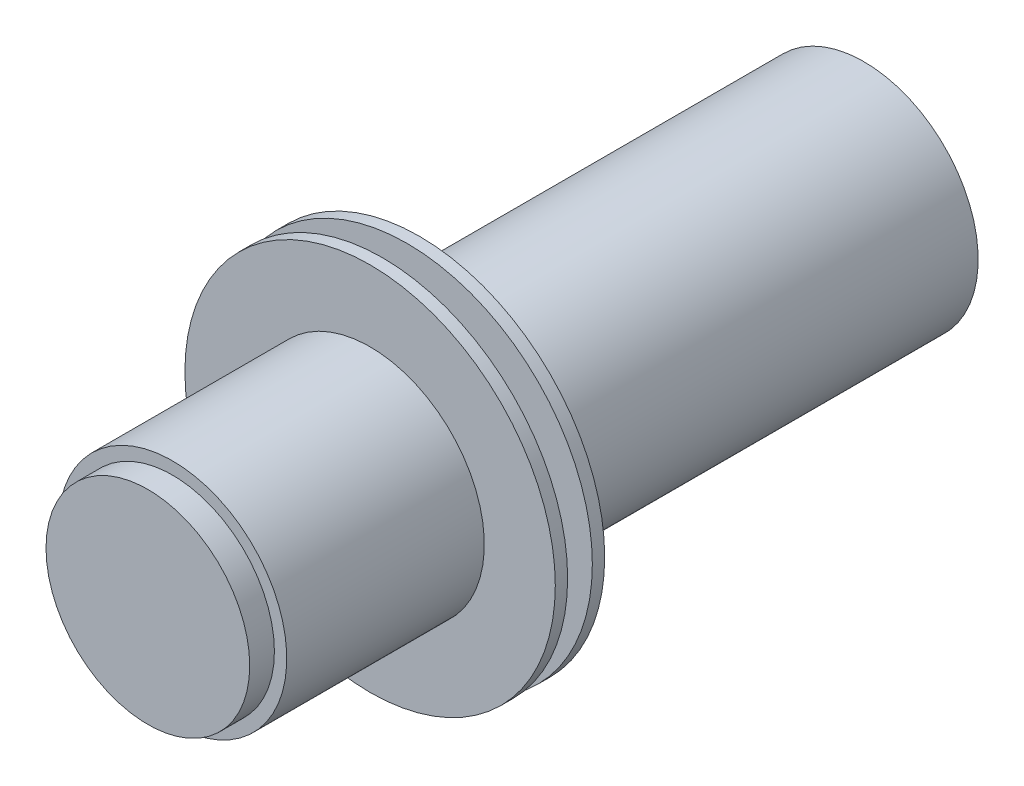
ISO-10303-21;
HEADER;
FILE_DESCRIPTION(('STEP AP214'),'2;1');
FILE_NAME('part.step','',(''),(''),'','','');
FILE_SCHEMA(('AUTOMOTIVE_DESIGN { 1 0 10303 214 1 1 1 1 }'));
ENDSEC;
DATA;
#1=APPLICATION_CONTEXT('core data for automotive mechanical design processes');
#2=APPLICATION_PROTOCOL_DEFINITION('international standard','automotive_design',2000,#1);
#3=PRODUCT_CONTEXT('',#1,'mechanical');
#4=PRODUCT('Part','Part','',(#3));
#5=PRODUCT_RELATED_PRODUCT_CATEGORY('part','',(#4));
#6=PRODUCT_DEFINITION_FORMATION('','',#4);
#7=PRODUCT_DEFINITION_CONTEXT('part definition',#1,'design');
#8=PRODUCT_DEFINITION('design','',#6,#7);
#9=PRODUCT_DEFINITION_SHAPE('','',#8);
#10=(LENGTH_UNIT() NAMED_UNIT(*) SI_UNIT(.MILLI.,.METRE.));
#11=(NAMED_UNIT(*) PLANE_ANGLE_UNIT() SI_UNIT($,.RADIAN.));
#12=(NAMED_UNIT(*) SI_UNIT($,.STERADIAN.) SOLID_ANGLE_UNIT());
#13=UNCERTAINTY_MEASURE_WITH_UNIT(LENGTH_MEASURE(1.E-05),#10,'distance_accuracy_value','');
#14=(GEOMETRIC_REPRESENTATION_CONTEXT(3) GLOBAL_UNCERTAINTY_ASSIGNED_CONTEXT((#13)) GLOBAL_UNIT_ASSIGNED_CONTEXT((#10,
#11,#12)) REPRESENTATION_CONTEXT('',''));
#15=CARTESIAN_POINT('',(0.,0.,0.));
#16=DIRECTION('',(0.,0.,1.));
#17=DIRECTION('',(1.,0.,0.));
#18=AXIS2_PLACEMENT_3D('',#15,#16,#17);
#19=CARTESIAN_POINT('',(0.,0.,58.));
#20=DIRECTION('',(0.,0.,-1.));
#21=DIRECTION('',(-1.,0.,0.));
#22=AXIS2_PLACEMENT_3D('',#19,#20,#21);
#23=CYLINDRICAL_SURFACE('',#22,9.25);
#24=CARTESIAN_POINT('',(0.,0.,37.));
#25=DIRECTION('',(0.,0.,1.));
#26=DIRECTION('',(1.,0.,0.));
#27=AXIS2_PLACEMENT_3D('',#24,#25,#26);
#28=CIRCLE('',#27,9.25);
#29=CARTESIAN_POINT('',(-9.25,0.,37.));
#30=VERTEX_POINT('',#29);
#31=EDGE_CURVE('E48',#30,#30,#28,.T.);
#32=CARTESIAN_POINT('',(0.,0.,39.));
#33=DIRECTION('',(0.,0.,1.));
#34=DIRECTION('',(1.,0.,0.));
#35=AXIS2_PLACEMENT_3D('',#32,#33,#34);
#36=CIRCLE('',#35,9.25);
#37=CARTESIAN_POINT('',(-9.25,0.,39.));
#38=VERTEX_POINT('',#37);
#39=EDGE_CURVE('E10',#38,#38,#36,.T.);
#40=CARTESIAN_POINT('',(-9.25,0.,37.));
#41=CARTESIAN_POINT('',(-9.25,0.,37.0208333333333));
#42=CARTESIAN_POINT('',(-9.25,0.,37.0416666666667));
#43=CARTESIAN_POINT('',(-9.25,0.,37.0833333333333));
#44=CARTESIAN_POINT('',(-9.25,0.,37.1041666666667));
#45=CARTESIAN_POINT('',(-9.25,0.,37.1458333333333));
#46=CARTESIAN_POINT('',(-9.25,0.,37.1666666666667));
#47=CARTESIAN_POINT('',(-9.25,0.,37.2083333333333));
#48=CARTESIAN_POINT('',(-9.25,0.,37.2291666666667));
#49=CARTESIAN_POINT('',(-9.25,0.,37.2708333333333));
#50=CARTESIAN_POINT('',(-9.25,0.,37.2916666666667));
#51=CARTESIAN_POINT('',(-9.25,0.,37.3333333333333));
#52=CARTESIAN_POINT('',(-9.25,0.,37.3541666666667));
#53=CARTESIAN_POINT('',(-9.25,0.,37.3958333333333));
#54=CARTESIAN_POINT('',(-9.25,0.,37.4166666666667));
#55=CARTESIAN_POINT('',(-9.25,0.,37.4583333333333));
#56=CARTESIAN_POINT('',(-9.25,0.,37.4791666666667));
#57=CARTESIAN_POINT('',(-9.25,0.,37.5208333333333));
#58=CARTESIAN_POINT('',(-9.25,0.,37.5416666666667));
#59=CARTESIAN_POINT('',(-9.25,0.,37.5833333333333));
#60=CARTESIAN_POINT('',(-9.25,0.,37.6041666666667));
#61=CARTESIAN_POINT('',(-9.25,0.,37.6458333333333));
#62=CARTESIAN_POINT('',(-9.25,0.,37.6666666666667));
#63=CARTESIAN_POINT('',(-9.25,0.,37.7083333333333));
#64=CARTESIAN_POINT('',(-9.25,0.,37.7291666666667));
#65=CARTESIAN_POINT('',(-9.25,0.,37.7708333333333));
#66=CARTESIAN_POINT('',(-9.25,0.,37.7916666666667));
#67=CARTESIAN_POINT('',(-9.25,0.,37.8333333333333));
#68=CARTESIAN_POINT('',(-9.25,0.,37.8541666666667));
#69=CARTESIAN_POINT('',(-9.25,0.,37.8958333333333));
#70=CARTESIAN_POINT('',(-9.25,0.,37.9166666666667));
#71=CARTESIAN_POINT('',(-9.25,0.,37.9583333333333));
#72=CARTESIAN_POINT('',(-9.25,0.,37.9791666666667));
#73=CARTESIAN_POINT('',(-9.25,0.,38.0208333333333));
#74=CARTESIAN_POINT('',(-9.25,0.,38.0416666666667));
#75=CARTESIAN_POINT('',(-9.25,0.,38.0833333333333));
#76=CARTESIAN_POINT('',(-9.25,0.,38.1041666666667));
#77=CARTESIAN_POINT('',(-9.25,0.,38.1458333333333));
#78=CARTESIAN_POINT('',(-9.25,0.,38.1666666666667));
#79=CARTESIAN_POINT('',(-9.25,0.,38.2083333333333));
#80=CARTESIAN_POINT('',(-9.25,0.,38.2291666666667));
#81=CARTESIAN_POINT('',(-9.25,0.,38.2708333333333));
#82=CARTESIAN_POINT('',(-9.25,0.,38.2916666666667));
#83=CARTESIAN_POINT('',(-9.25,0.,38.3333333333333));
#84=CARTESIAN_POINT('',(-9.25,0.,38.3541666666667));
#85=CARTESIAN_POINT('',(-9.25,0.,38.3958333333333));
#86=CARTESIAN_POINT('',(-9.25,0.,38.4166666666667));
#87=CARTESIAN_POINT('',(-9.25,0.,38.4583333333333));
#88=CARTESIAN_POINT('',(-9.25,0.,38.4791666666667));
#89=CARTESIAN_POINT('',(-9.25,0.,38.5208333333333));
#90=CARTESIAN_POINT('',(-9.25,0.,38.5416666666667));
#91=CARTESIAN_POINT('',(-9.25,0.,38.5833333333333));
#92=CARTESIAN_POINT('',(-9.25,0.,38.6041666666667));
#93=CARTESIAN_POINT('',(-9.25,0.,38.6458333333333));
#94=CARTESIAN_POINT('',(-9.25,0.,38.6666666666667));
#95=CARTESIAN_POINT('',(-9.25,0.,38.7083333333333));
#96=CARTESIAN_POINT('',(-9.25,0.,38.7291666666667));
#97=CARTESIAN_POINT('',(-9.25,0.,38.7708333333333));
#98=CARTESIAN_POINT('',(-9.25,0.,38.7916666666667));
#99=CARTESIAN_POINT('',(-9.25,0.,38.8333333333333));
#100=CARTESIAN_POINT('',(-9.25,0.,38.8541666666667));
#101=CARTESIAN_POINT('',(-9.25,0.,38.8958333333333));
#102=CARTESIAN_POINT('',(-9.25,0.,38.9166666666667));
#103=CARTESIAN_POINT('',(-9.25,0.,38.9583333333333));
#104=CARTESIAN_POINT('',(-9.25,0.,38.9791666666667));
#105=CARTESIAN_POINT('',(-9.25,0.,39.));
#106=B_SPLINE_CURVE_WITH_KNOTS('',3,(#40,#41,#42,#43,#44,#45,#46,#47,#48,#49,#50,#51,#52,#53,
#54,#55,#56,#57,#58,#59,#60,#61,#62,#63,#64,#65,#66,#67,#68,#69,#70,#71,#72,#73,#74,#75,#76,#77,
#78,#79,#80,#81,#82,#83,#84,#85,#86,#87,#88,#89,#90,#91,#92,#93,#94,#95,#96,#97,#98,#99,#100,
#101,#102,#103,#104,#105),.UNSPECIFIED.,.F.,.F.,(4,2,2,2,2,2,2,2,2,2,2,2,2,2,2,2,2,2,2,2,2,2,2,
2,2,2,2,2,2,2,2,2,4),(0.,0.0624999999999931,0.125,0.187499999999993,0.25,0.312499999999993,
0.375,0.437499999999993,0.5,0.562499999999994,0.625000000000001,0.687499999999994,
0.750000000000001,0.812499999999994,0.875000000000001,0.937499999999994,1.,1.06249999999999,
1.125,1.18749999999999,1.25,1.31249999999999,1.375,1.43749999999999,1.5,1.56249999999999,1.625,
1.68749999999999,1.75,1.81249999999999,1.875,1.93749999999999,2.),.UNSPECIFIED.);
#107=EDGE_CURVE('BSEAM33',#30,#38,#106,.T.);
#108=ORIENTED_EDGE('',*,*,#31,.T.);
#109=ORIENTED_EDGE('',*,*,#39,.F.);
#110=ORIENTED_EDGE('',*,*,#107,.T.);
#111=ORIENTED_EDGE('',*,*,#107,.F.);
#112=EDGE_LOOP('',(#108,#110,#109,#111));
#113=FACE_BOUND('',#112,.T.);
#114=ADVANCED_FACE('F33',(#113),#23,.T.);
#115=CARTESIAN_POINT('',(0.,0.,37.));
#116=DIRECTION('',(0.,0.,-1.));
#117=DIRECTION('',(-1.,0.,0.));
#118=AXIS2_PLACEMENT_3D('',#115,#116,#117);
#119=CYLINDRICAL_SURFACE('',#118,15.);
#120=CARTESIAN_POINT('',(0.,0.,37.));
#121=DIRECTION('',(0.,0.,1.));
#122=DIRECTION('',(1.,0.,0.));
#123=AXIS2_PLACEMENT_3D('',#120,#121,#122);
#124=CIRCLE('',#123,15.);
#125=CARTESIAN_POINT('',(15.,0.,37.));
#126=VERTEX_POINT('',#125);
#127=EDGE_CURVE('E51',#126,#126,#124,.T.);
#128=ORIENTED_EDGE('',*,*,#127,.F.);
#129=EDGE_LOOP('',(#128));
#130=FACE_BOUND('',#129,.T.);
#131=CARTESIAN_POINT('',(0.,0.,36.));
#132=DIRECTION('',(0.,0.,1.));
#133=DIRECTION('',(1.,0.,0.));
#134=AXIS2_PLACEMENT_3D('',#131,#132,#133);
#135=CIRCLE('',#134,15.);
#136=CARTESIAN_POINT('',(15.,0.,36.));
#137=VERTEX_POINT('',#136);
#138=EDGE_CURVE('E63',#137,#137,#135,.T.);
#139=ORIENTED_EDGE('',*,*,#138,.T.);
#140=EDGE_LOOP('',(#139));
#141=FACE_BOUND('',#140,.T.);
#142=ADVANCED_FACE('F95',(#130,#141),#119,.T.);
#143=CARTESIAN_POINT('',(0.,0.,37.));
#144=DIRECTION('',(0.,0.,1.));
#145=DIRECTION('',(1.,0.,0.));
#146=AXIS2_PLACEMENT_3D('',#143,#144,#145);
#147=PLANE('',#146);
#148=ORIENTED_EDGE('',*,*,#31,.F.);
#149=EDGE_LOOP('',(#148));
#150=FACE_BOUND('',#149,.T.);
#151=ORIENTED_EDGE('',*,*,#127,.T.);
#152=EDGE_LOOP('',(#151));
#153=FACE_BOUND('',#152,.T.);
#154=ADVANCED_FACE('F102',(#150,#153),#147,.T.);
#155=CARTESIAN_POINT('',(0.,0.,36.));
#156=DIRECTION('',(0.,0.,1.));
#157=DIRECTION('',(1.,0.,0.));
#158=AXIS2_PLACEMENT_3D('',#155,#156,#157);
#159=PLANE('',#158);
#160=CARTESIAN_POINT('',(0.,0.,36.));
#161=DIRECTION('',(0.,0.,1.));
#162=DIRECTION('',(1.,0.,0.));
#163=AXIS2_PLACEMENT_3D('',#160,#161,#162);
#164=CIRCLE('',#163,9.25);
#165=CARTESIAN_POINT('',(-9.25,0.,36.));
#166=VERTEX_POINT('',#165);
#167=EDGE_CURVE('E41',#166,#166,#164,.T.);
#168=ORIENTED_EDGE('',*,*,#167,.T.);
#169=EDGE_LOOP('',(#168));
#170=FACE_BOUND('',#169,.T.);
#171=ORIENTED_EDGE('',*,*,#138,.F.);
#172=EDGE_LOOP('',(#171));
#173=FACE_BOUND('',#172,.T.);
#174=ADVANCED_FACE('F128',(#170,#173),#159,.F.);
#175=CARTESIAN_POINT('',(0.,0.,0.));
#176=DIRECTION('',(0.,0.,1.));
#177=DIRECTION('',(1.,0.,0.));
#178=AXIS2_PLACEMENT_3D('',#175,#176,#177);
#179=PLANE('',#178);
#180=CARTESIAN_POINT('',(0.,0.,0.));
#181=DIRECTION('',(0.,0.,1.));
#182=DIRECTION('',(1.,0.,0.));
#183=AXIS2_PLACEMENT_3D('',#180,#181,#182);
#184=CIRCLE('',#183,9.25);
#185=CARTESIAN_POINT('',(-9.25,0.,0.));
#186=VERTEX_POINT('',#185);
#187=EDGE_CURVE('E45',#186,#186,#184,.T.);
#188=ORIENTED_EDGE('',*,*,#187,.F.);
#189=EDGE_LOOP('',(#188));
#190=FACE_BOUND('',#189,.T.);
#191=ADVANCED_FACE('F106',(#190),#179,.F.);
#192=CARTESIAN_POINT('',(-9.25,0.,0.));
#193=CARTESIAN_POINT('',(-9.25,0.,0.375));
#194=CARTESIAN_POINT('',(-9.25,0.,0.750000000000001));
#195=CARTESIAN_POINT('',(-9.25,0.,1.5));
#196=CARTESIAN_POINT('',(-9.25,0.,1.875));
#197=CARTESIAN_POINT('',(-9.25,0.,2.625));
#198=CARTESIAN_POINT('',(-9.25,0.,3.));
#199=CARTESIAN_POINT('',(-9.25,0.,3.75));
#200=CARTESIAN_POINT('',(-9.25,0.,4.125));
#201=CARTESIAN_POINT('',(-9.25,0.,4.875));
#202=CARTESIAN_POINT('',(-9.25,0.,5.25));
#203=CARTESIAN_POINT('',(-9.25,0.,6.));
#204=CARTESIAN_POINT('',(-9.25,0.,6.375));
#205=CARTESIAN_POINT('',(-9.25,0.,7.125));
#206=CARTESIAN_POINT('',(-9.25,0.,7.5));
#207=CARTESIAN_POINT('',(-9.25,0.,8.25));
#208=CARTESIAN_POINT('',(-9.25,0.,8.625));
#209=CARTESIAN_POINT('',(-9.25,0.,9.375));
#210=CARTESIAN_POINT('',(-9.25,0.,9.75));
#211=CARTESIAN_POINT('',(-9.25,0.,10.5));
#212=CARTESIAN_POINT('',(-9.25,0.,10.875));
#213=CARTESIAN_POINT('',(-9.25,0.,11.625));
#214=CARTESIAN_POINT('',(-9.25,0.,12.));
#215=CARTESIAN_POINT('',(-9.25,0.,12.75));
#216=CARTESIAN_POINT('',(-9.25,0.,13.125));
#217=CARTESIAN_POINT('',(-9.25,0.,13.875));
#218=CARTESIAN_POINT('',(-9.25,0.,14.25));
#219=CARTESIAN_POINT('',(-9.25,0.,15.));
#220=CARTESIAN_POINT('',(-9.25,0.,15.375));
#221=CARTESIAN_POINT('',(-9.25,0.,16.125));
#222=CARTESIAN_POINT('',(-9.25,0.,16.5));
#223=CARTESIAN_POINT('',(-9.25,0.,17.25));
#224=CARTESIAN_POINT('',(-9.25,0.,17.625));
#225=CARTESIAN_POINT('',(-9.25,0.,18.375));
#226=CARTESIAN_POINT('',(-9.25,0.,18.75));
#227=CARTESIAN_POINT('',(-9.25,0.,19.5));
#228=CARTESIAN_POINT('',(-9.25,0.,19.875));
#229=CARTESIAN_POINT('',(-9.25,0.,20.625));
#230=CARTESIAN_POINT('',(-9.25,0.,21.));
#231=CARTESIAN_POINT('',(-9.25,0.,21.75));
#232=CARTESIAN_POINT('',(-9.25,0.,22.125));
#233=CARTESIAN_POINT('',(-9.25,0.,22.875));
#234=CARTESIAN_POINT('',(-9.25,0.,23.25));
#235=CARTESIAN_POINT('',(-9.25,0.,24.));
#236=CARTESIAN_POINT('',(-9.25,0.,24.375));
#237=CARTESIAN_POINT('',(-9.25,0.,25.125));
#238=CARTESIAN_POINT('',(-9.25,0.,25.5));
#239=CARTESIAN_POINT('',(-9.25,0.,26.25));
#240=CARTESIAN_POINT('',(-9.25,0.,26.625));
#241=CARTESIAN_POINT('',(-9.25,0.,27.375));
#242=CARTESIAN_POINT('',(-9.25,0.,27.75));
#243=CARTESIAN_POINT('',(-9.25,0.,28.5));
#244=CARTESIAN_POINT('',(-9.25,0.,28.875));
#245=CARTESIAN_POINT('',(-9.25,0.,29.625));
#246=CARTESIAN_POINT('',(-9.25,0.,30.));
#247=CARTESIAN_POINT('',(-9.25,0.,30.75));
#248=CARTESIAN_POINT('',(-9.25,0.,31.125));
#249=CARTESIAN_POINT('',(-9.25,0.,31.875));
#250=CARTESIAN_POINT('',(-9.25,0.,32.25));
#251=CARTESIAN_POINT('',(-9.25,0.,33.));
#252=CARTESIAN_POINT('',(-9.25,0.,33.375));
#253=CARTESIAN_POINT('',(-9.25,0.,34.125));
#254=CARTESIAN_POINT('',(-9.25,0.,34.5));
#255=CARTESIAN_POINT('',(-9.25,0.,35.25));
#256=CARTESIAN_POINT('',(-9.25,0.,35.625));
#257=CARTESIAN_POINT('',(-9.25,0.,36.));
#258=B_SPLINE_CURVE_WITH_KNOTS('',3,(#192,#193,#194,#195,#196,#197,#198,#199,#200,#201,#202,
#203,#204,#205,#206,#207,#208,#209,#210,#211,#212,#213,#214,#215,#216,#217,#218,#219,#220,#221,
#222,#223,#224,#225,#226,#227,#228,#229,#230,#231,#232,#233,#234,#235,#236,#237,#238,#239,#240,
#241,#242,#243,#244,#245,#246,#247,#248,#249,#250,#251,#252,#253,#254,#255,#256,#257),
.UNSPECIFIED.,.F.,.F.,(4,2,2,2,2,2,2,2,2,2,2,2,2,2,2,2,2,2,2,2,2,2,2,2,2,2,2,2,2,2,2,2,4),(0.,
1.125,2.25,3.375,4.5,5.625,6.75,7.875,9.,10.125,11.25,12.375,13.5,14.625,15.75,16.875,18.,
19.125,20.25,21.375,22.5,23.625,24.75,25.875,27.,28.125,29.25,30.375,31.5,32.625,33.75,34.875,
36.),.UNSPECIFIED.);
#259=EDGE_CURVE('BSEAM91',#186,#166,#258,.T.);
#260=ORIENTED_EDGE('',*,*,#187,.T.);
#261=ORIENTED_EDGE('',*,*,#167,.F.);
#262=ORIENTED_EDGE('',*,*,#259,.T.);
#263=ORIENTED_EDGE('',*,*,#259,.F.);
#264=EDGE_LOOP('',(#260,#262,#261,#263));
#265=FACE_BOUND('',#264,.T.);
#266=ADVANCED_FACE('F91',(#265),#23,.T.);
#267=CARTESIAN_POINT('',(0.,0.,40.));
#268=DIRECTION('',(0.,0.,-1.));
#269=DIRECTION('',(-1.,0.,0.));
#270=AXIS2_PLACEMENT_3D('',#267,#268,#269);
#271=CYLINDRICAL_SURFACE('',#270,15.);
#272=CARTESIAN_POINT('',(0.,0.,40.));
#273=DIRECTION('',(0.,0.,1.));
#274=DIRECTION('',(1.,0.,0.));
#275=AXIS2_PLACEMENT_3D('',#272,#273,#274);
#276=CIRCLE('',#275,15.);
#277=CARTESIAN_POINT('',(15.,0.,40.));
#278=VERTEX_POINT('',#277);
#279=EDGE_CURVE('E71',#278,#278,#276,.T.);
#280=ORIENTED_EDGE('',*,*,#279,.F.);
#281=EDGE_LOOP('',(#280));
#282=FACE_BOUND('',#281,.T.);
#283=CARTESIAN_POINT('',(0.,0.,39.));
#284=DIRECTION('',(0.,0.,1.));
#285=DIRECTION('',(1.,0.,0.));
#286=AXIS2_PLACEMENT_3D('',#283,#284,#285);
#287=CIRCLE('',#286,15.);
#288=CARTESIAN_POINT('',(15.,0.,39.));
#289=VERTEX_POINT('',#288);
#290=EDGE_CURVE('E68',#289,#289,#287,.T.);
#291=ORIENTED_EDGE('',*,*,#290,.T.);
#292=EDGE_LOOP('',(#291));
#293=FACE_BOUND('',#292,.T.);
#294=ADVANCED_FACE('F83',(#282,#293),#271,.T.);
#295=CARTESIAN_POINT('',(0.,0.,40.));
#296=DIRECTION('',(0.,0.,1.));
#297=DIRECTION('',(1.,0.,0.));
#298=AXIS2_PLACEMENT_3D('',#295,#296,#297);
#299=PLANE('',#298);
#300=CARTESIAN_POINT('',(0.,0.,40.));
#301=DIRECTION('',(0.,0.,1.));
#302=DIRECTION('',(1.,0.,0.));
#303=AXIS2_PLACEMENT_3D('',#300,#301,#302);
#304=CIRCLE('',#303,9.25);
#305=CARTESIAN_POINT('',(-9.25,0.,40.));
#306=VERTEX_POINT('',#305);
#307=EDGE_CURVE('E37',#306,#306,#304,.T.);
#308=ORIENTED_EDGE('',*,*,#307,.F.);
#309=EDGE_LOOP('',(#308));
#310=FACE_BOUND('',#309,.T.);
#311=ORIENTED_EDGE('',*,*,#279,.T.);
#312=EDGE_LOOP('',(#311));
#313=FACE_BOUND('',#312,.T.);
#314=ADVANCED_FACE('F80',(#310,#313),#299,.T.);
#315=CARTESIAN_POINT('',(0.,0.,39.));
#316=DIRECTION('',(0.,0.,1.));
#317=DIRECTION('',(1.,0.,0.));
#318=AXIS2_PLACEMENT_3D('',#315,#316,#317);
#319=PLANE('',#318);
#320=ORIENTED_EDGE('',*,*,#39,.T.);
#321=EDGE_LOOP('',(#320));
#322=FACE_BOUND('',#321,.T.);
#323=ORIENTED_EDGE('',*,*,#290,.F.);
#324=EDGE_LOOP('',(#323));
#325=FACE_BOUND('',#324,.T.);
#326=ADVANCED_FACE('F82',(#322,#325),#319,.F.);
#327=CARTESIAN_POINT('',(0.,0.,58.));
#328=DIRECTION('',(0.,0.,1.));
#329=DIRECTION('',(1.,0.,0.));
#330=AXIS2_PLACEMENT_3D('',#327,#328,#329);
#331=PLANE('',#330);
#332=CARTESIAN_POINT('',(0.,0.,58.));
#333=DIRECTION('',(0.,0.,1.));
#334=DIRECTION('',(1.,0.,0.));
#335=AXIS2_PLACEMENT_3D('',#332,#333,#334);
#336=CIRCLE('',#335,8.25);
#337=CARTESIAN_POINT('',(8.25,0.,58.));
#338=VERTEX_POINT('',#337);
#339=EDGE_CURVE('E50',#338,#338,#336,.T.);
#340=ORIENTED_EDGE('',*,*,#339,.T.);
#341=EDGE_LOOP('',(#340));
#342=FACE_BOUND('',#341,.T.);
#343=ADVANCED_FACE('F89',(#342),#331,.T.);
#344=CARTESIAN_POINT('',(0.,0.,56.));
#345=DIRECTION('',(0.,0.,1.));
#346=DIRECTION('',(1.,0.,0.));
#347=AXIS2_PLACEMENT_3D('',#344,#345,#346);
#348=CYLINDRICAL_SURFACE('',#347,8.25);
#349=CARTESIAN_POINT('',(0.,0.,56.));
#350=DIRECTION('',(0.,0.,1.));
#351=DIRECTION('',(1.,0.,0.));
#352=AXIS2_PLACEMENT_3D('',#349,#350,#351);
#353=CIRCLE('',#352,8.25);
#354=CARTESIAN_POINT('',(8.25,0.,56.));
#355=VERTEX_POINT('',#354);
#356=EDGE_CURVE('E58',#355,#355,#353,.T.);
#357=ORIENTED_EDGE('',*,*,#356,.T.);
#358=EDGE_LOOP('',(#357));
#359=FACE_BOUND('',#358,.T.);
#360=ORIENTED_EDGE('',*,*,#339,.F.);
#361=EDGE_LOOP('',(#360));
#362=FACE_BOUND('',#361,.T.);
#363=ADVANCED_FACE('F114',(#359,#362),#348,.T.);
#364=CARTESIAN_POINT('',(0.,0.,56.));
#365=DIRECTION('',(0.,0.,1.));
#366=DIRECTION('',(1.,0.,0.));
#367=AXIS2_PLACEMENT_3D('',#364,#365,#366);
#368=PLANE('',#367);
#369=ORIENTED_EDGE('',*,*,#356,.F.);
#370=EDGE_LOOP('',(#369));
#371=FACE_BOUND('',#370,.T.);
#372=CARTESIAN_POINT('',(0.,0.,56.));
#373=DIRECTION('',(0.,0.,1.));
#374=DIRECTION('',(1.,0.,0.));
#375=AXIS2_PLACEMENT_3D('',#372,#373,#374);
#376=CIRCLE('',#375,9.25);
#377=CARTESIAN_POINT('',(-9.25,0.,56.));
#378=VERTEX_POINT('',#377);
#379=EDGE_CURVE('E55',#378,#378,#376,.T.);
#380=ORIENTED_EDGE('',*,*,#379,.T.);
#381=EDGE_LOOP('',(#380));
#382=FACE_BOUND('',#381,.T.);
#383=ADVANCED_FACE('F109',(#371,#382),#368,.T.);
#384=CARTESIAN_POINT('',(-9.25,0.,40.));
#385=CARTESIAN_POINT('',(-9.25,0.,40.1666666666667));
#386=CARTESIAN_POINT('',(-9.25,0.,40.3333333333333));
#387=CARTESIAN_POINT('',(-9.25,0.,40.6666666666667));
#388=CARTESIAN_POINT('',(-9.25,0.,40.8333333333333));
#389=CARTESIAN_POINT('',(-9.25,0.,41.1666666666667));
#390=CARTESIAN_POINT('',(-9.25,0.,41.3333333333333));
#391=CARTESIAN_POINT('',(-9.25,0.,41.6666666666667));
#392=CARTESIAN_POINT('',(-9.25,0.,41.8333333333333));
#393=CARTESIAN_POINT('',(-9.25,0.,42.1666666666667));
#394=CARTESIAN_POINT('',(-9.25,0.,42.3333333333333));
#395=CARTESIAN_POINT('',(-9.25,0.,42.6666666666667));
#396=CARTESIAN_POINT('',(-9.25,0.,42.8333333333333));
#397=CARTESIAN_POINT('',(-9.25,0.,43.1666666666667));
#398=CARTESIAN_POINT('',(-9.25,0.,43.3333333333333));
#399=CARTESIAN_POINT('',(-9.25,0.,43.6666666666667));
#400=CARTESIAN_POINT('',(-9.25,0.,43.8333333333333));
#401=CARTESIAN_POINT('',(-9.25,0.,44.1666666666667));
#402=CARTESIAN_POINT('',(-9.25,0.,44.3333333333333));
#403=CARTESIAN_POINT('',(-9.25,0.,44.6666666666667));
#404=CARTESIAN_POINT('',(-9.25,0.,44.8333333333333));
#405=CARTESIAN_POINT('',(-9.25,0.,45.1666666666667));
#406=CARTESIAN_POINT('',(-9.25,0.,45.3333333333333));
#407=CARTESIAN_POINT('',(-9.25,0.,45.6666666666667));
#408=CARTESIAN_POINT('',(-9.25,0.,45.8333333333333));
#409=CARTESIAN_POINT('',(-9.25,0.,46.1666666666667));
#410=CARTESIAN_POINT('',(-9.25,0.,46.3333333333333));
#411=CARTESIAN_POINT('',(-9.25,0.,46.6666666666667));
#412=CARTESIAN_POINT('',(-9.25,0.,46.8333333333333));
#413=CARTESIAN_POINT('',(-9.25,0.,47.1666666666667));
#414=CARTESIAN_POINT('',(-9.25,0.,47.3333333333333));
#415=CARTESIAN_POINT('',(-9.25,0.,47.6666666666667));
#416=CARTESIAN_POINT('',(-9.25,0.,47.8333333333333));
#417=CARTESIAN_POINT('',(-9.25,0.,48.1666666666667));
#418=CARTESIAN_POINT('',(-9.25,0.,48.3333333333333));
#419=CARTESIAN_POINT('',(-9.25,0.,48.6666666666667));
#420=CARTESIAN_POINT('',(-9.25,0.,48.8333333333333));
#421=CARTESIAN_POINT('',(-9.25,0.,49.1666666666667));
#422=CARTESIAN_POINT('',(-9.25,0.,49.3333333333333));
#423=CARTESIAN_POINT('',(-9.25,0.,49.6666666666667));
#424=CARTESIAN_POINT('',(-9.25,0.,49.8333333333333));
#425=CARTESIAN_POINT('',(-9.25,0.,50.1666666666667));
#426=CARTESIAN_POINT('',(-9.25,0.,50.3333333333333));
#427=CARTESIAN_POINT('',(-9.25,0.,50.6666666666667));
#428=CARTESIAN_POINT('',(-9.25,0.,50.8333333333333));
#429=CARTESIAN_POINT('',(-9.25,0.,51.1666666666667));
#430=CARTESIAN_POINT('',(-9.25,0.,51.3333333333333));
#431=CARTESIAN_POINT('',(-9.25,0.,51.6666666666667));
#432=CARTESIAN_POINT('',(-9.25,0.,51.8333333333333));
#433=CARTESIAN_POINT('',(-9.25,0.,52.1666666666667));
#434=CARTESIAN_POINT('',(-9.25,0.,52.3333333333333));
#435=CARTESIAN_POINT('',(-9.25,0.,52.6666666666667));
#436=CARTESIAN_POINT('',(-9.25,0.,52.8333333333333));
#437=CARTESIAN_POINT('',(-9.25,0.,53.1666666666667));
#438=CARTESIAN_POINT('',(-9.25,0.,53.3333333333333));
#439=CARTESIAN_POINT('',(-9.25,0.,53.6666666666667));
#440=CARTESIAN_POINT('',(-9.25,0.,53.8333333333333));
#441=CARTESIAN_POINT('',(-9.25,0.,54.1666666666667));
#442=CARTESIAN_POINT('',(-9.25,0.,54.3333333333333));
#443=CARTESIAN_POINT('',(-9.25,0.,54.6666666666667));
#444=CARTESIAN_POINT('',(-9.25,0.,54.8333333333333));
#445=CARTESIAN_POINT('',(-9.25,0.,55.1666666666667));
#446=CARTESIAN_POINT('',(-9.25,0.,55.3333333333333));
#447=CARTESIAN_POINT('',(-9.25,0.,55.6666666666667));
#448=CARTESIAN_POINT('',(-9.25,0.,55.8333333333333));
#449=CARTESIAN_POINT('',(-9.25,0.,56.));
#450=B_SPLINE_CURVE_WITH_KNOTS('',3,(#384,#385,#386,#387,#388,#389,#390,#391,#392,#393,#394,
#395,#396,#397,#398,#399,#400,#401,#402,#403,#404,#405,#406,#407,#408,#409,#410,#411,#412,#413,
#414,#415,#416,#417,#418,#419,#420,#421,#422,#423,#424,#425,#426,#427,#428,#429,#430,#431,#432,
#433,#434,#435,#436,#437,#438,#439,#440,#441,#442,#443,#444,#445,#446,#447,#448,#449),
.UNSPECIFIED.,.F.,.F.,(4,2,2,2,2,2,2,2,2,2,2,2,2,2,2,2,2,2,2,2,2,2,2,2,2,2,2,2,2,2,2,2,4),(0.,
0.5,1.,1.5,1.99999999999999,2.5,3.,3.5,4.,4.49999999999999,4.99999999999999,5.49999999999999,
5.99999999999999,6.49999999999999,6.99999999999999,7.49999999999999,7.99999999999999,
8.49999999999999,8.99999999999999,9.49999999999999,9.99999999999999,10.5,11.,11.5,12.,12.5,13.,
13.5,14.,14.5,15.,15.5,16.),.UNSPECIFIED.);
#451=EDGE_CURVE('BSEAM35',#306,#378,#450,.T.);
#452=ORIENTED_EDGE('',*,*,#307,.T.);
#453=ORIENTED_EDGE('',*,*,#379,.F.);
#454=ORIENTED_EDGE('',*,*,#451,.T.);
#455=ORIENTED_EDGE('',*,*,#451,.F.);
#456=EDGE_LOOP('',(#452,#454,#453,#455));
#457=FACE_BOUND('',#456,.T.);
#458=ADVANCED_FACE('F35',(#457),#23,.T.);
#459=CLOSED_SHELL('',(#114,#142,#154,#174,#191,#266,#294,#314,#326,#343,#363,#383,#458));
#460=MANIFOLD_SOLID_BREP('B2',#459);
#461=ADVANCED_BREP_SHAPE_REPRESENTATION('',(#18,#460),#14);
#462=SHAPE_DEFINITION_REPRESENTATION(#9,#461);
ENDSEC;
END-ISO-10303-21;
